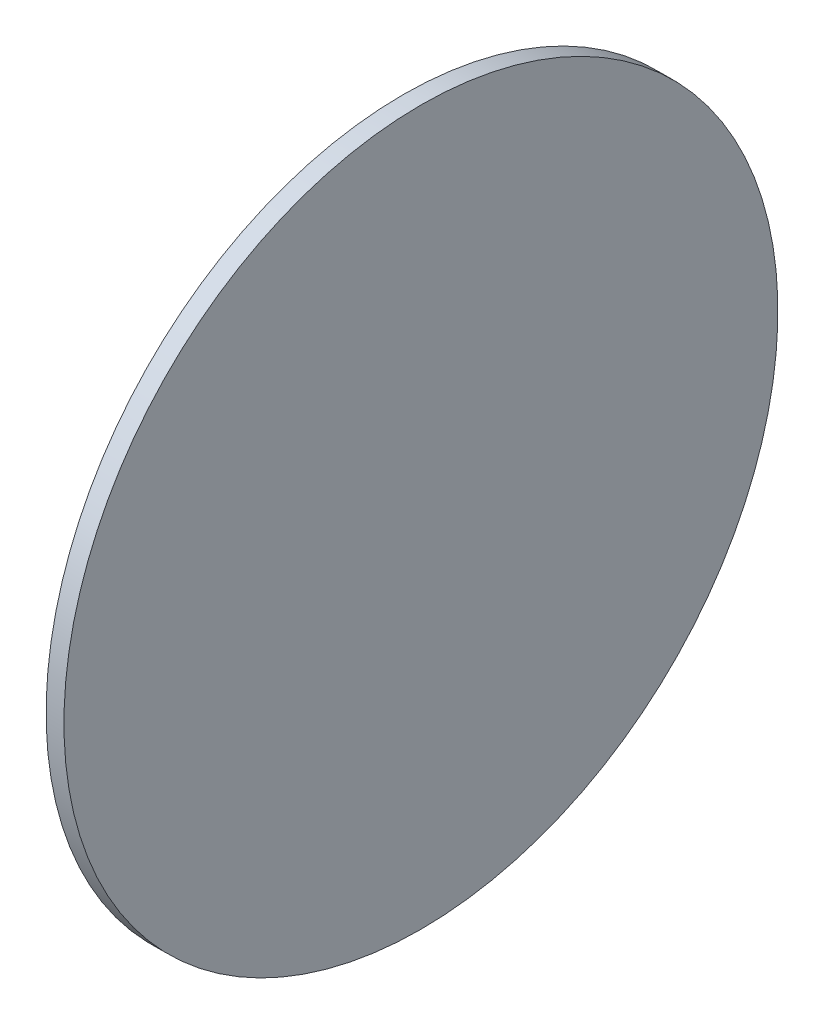
ISO-10303-21;
HEADER;
FILE_DESCRIPTION(('STEP AP214'),'2;1');
FILE_NAME('part.step','',(''),(''),'','','');
FILE_SCHEMA(('AUTOMOTIVE_DESIGN { 1 0 10303 214 1 1 1 1 }'));
ENDSEC;
DATA;
#1=APPLICATION_CONTEXT('core data for automotive mechanical design processes');
#2=APPLICATION_PROTOCOL_DEFINITION('international standard','automotive_design',2000,#1);
#3=PRODUCT_CONTEXT('',#1,'mechanical');
#4=PRODUCT('Part','Part','',(#3));
#5=PRODUCT_RELATED_PRODUCT_CATEGORY('part','',(#4));
#6=PRODUCT_DEFINITION_FORMATION('','',#4);
#7=PRODUCT_DEFINITION_CONTEXT('part definition',#1,'design');
#8=PRODUCT_DEFINITION('design','',#6,#7);
#9=PRODUCT_DEFINITION_SHAPE('','',#8);
#10=(LENGTH_UNIT() NAMED_UNIT(*) SI_UNIT(.MILLI.,.METRE.));
#11=(NAMED_UNIT(*) PLANE_ANGLE_UNIT() SI_UNIT($,.RADIAN.));
#12=(NAMED_UNIT(*) SI_UNIT($,.STERADIAN.) SOLID_ANGLE_UNIT());
#13=UNCERTAINTY_MEASURE_WITH_UNIT(LENGTH_MEASURE(1.E-05),#10,'distance_accuracy_value','');
#14=(GEOMETRIC_REPRESENTATION_CONTEXT(3) GLOBAL_UNCERTAINTY_ASSIGNED_CONTEXT((#13)) GLOBAL_UNIT_ASSIGNED_CONTEXT((#10,
#11,#12)) REPRESENTATION_CONTEXT('',''));
#15=CARTESIAN_POINT('',(0.,0.,0.));
#16=DIRECTION('',(0.,0.,1.));
#17=DIRECTION('',(1.,0.,0.));
#18=AXIS2_PLACEMENT_3D('',#15,#16,#17);
#19=CARTESIAN_POINT('',(218.672232897696,49.8959813156576,67.8606367334853));
#20=DIRECTION('',(1.,0.,0.));
#21=DIRECTION('',(0.,1.,0.));
#22=AXIS2_PLACEMENT_3D('',#19,#20,#21);
#23=CYLINDRICAL_SURFACE('',#22,9.99999999999999);
#24=CARTESIAN_POINT('',(218.672232897696,49.8959813156576,67.8606367334853));
#25=DIRECTION('',(-1.,0.,0.));
#26=DIRECTION('',(0.,-1.,0.));
#27=AXIS2_PLACEMENT_3D('',#24,#25,#26);
#28=CIRCLE('',#27,9.99999999999999);
#29=CARTESIAN_POINT('',(218.672232897696,39.8959813156576,67.8606367334853));
#30=VERTEX_POINT('',#29);
#31=EDGE_CURVE('E46',#30,#30,#28,.T.);
#32=ORIENTED_EDGE('',*,*,#31,.F.);
#33=EDGE_LOOP('',(#32));
#34=FACE_BOUND('',#33,.T.);
#35=CARTESIAN_POINT('',(219.172232897696,49.8959813156576,67.8606367334853));
#36=DIRECTION('',(-1.,0.,0.));
#37=DIRECTION('',(0.,-1.,0.));
#38=AXIS2_PLACEMENT_3D('',#35,#36,#37);
#39=CIRCLE('',#38,9.99999999999999);
#40=CARTESIAN_POINT('',(219.172232897696,39.8959813156576,67.8606367334853));
#41=VERTEX_POINT('',#40);
#42=EDGE_CURVE('E10',#41,#41,#39,.T.);
#43=ORIENTED_EDGE('',*,*,#42,.T.);
#44=EDGE_LOOP('',(#43));
#45=FACE_BOUND('',#44,.T.);
#46=ADVANCED_FACE('F36',(#34,#45),#23,.T.);
#47=CARTESIAN_POINT('',(219.172232897696,49.8959813156576,67.8606367334853));
#48=DIRECTION('',(-1.,0.,0.));
#49=DIRECTION('',(0.,-1.,0.));
#50=AXIS2_PLACEMENT_3D('',#47,#48,#49);
#51=PLANE('',#50);
#52=ORIENTED_EDGE('',*,*,#42,.F.);
#53=EDGE_LOOP('',(#52));
#54=FACE_BOUND('',#53,.T.);
#55=ADVANCED_FACE('F56',(#54),#51,.F.);
#56=CARTESIAN_POINT('',(218.672232897696,49.8959813156576,67.8606367334853));
#57=DIRECTION('',(-1.,0.,0.));
#58=DIRECTION('',(0.,-1.,0.));
#59=AXIS2_PLACEMENT_3D('',#56,#57,#58);
#60=CONICAL_SURFACE('',#59,9.99999999999999,0.872664625997167);
#61=CARTESIAN_POINT('',(218.872232897696,49.8959813156576,67.8606367334853));
#62=DIRECTION('',(-1.,0.,0.));
#63=DIRECTION('',(0.,-1.,0.));
#64=AXIS2_PLACEMENT_3D('',#61,#62,#63);
#65=CIRCLE('',#64,9.76164928148114);
#66=CARTESIAN_POINT('',(218.872232897696,40.1343320341765,67.8606367334853));
#67=VERTEX_POINT('',#66);
#68=EDGE_CURVE('E42',#67,#67,#65,.T.);
#69=ORIENTED_EDGE('',*,*,#68,.F.);
#70=EDGE_LOOP('',(#69));
#71=FACE_BOUND('',#70,.T.);
#72=ORIENTED_EDGE('',*,*,#31,.T.);
#73=EDGE_LOOP('',(#72));
#74=FACE_BOUND('',#73,.T.);
#75=ADVANCED_FACE('F53',(#71,#74),#60,.F.);
#76=CARTESIAN_POINT('',(218.872232897696,49.8959813156576,67.8606367334853));
#77=DIRECTION('',(-1.,0.,0.));
#78=DIRECTION('',(0.,-1.,0.));
#79=AXIS2_PLACEMENT_3D('',#76,#77,#78);
#80=PLANE('',#79);
#81=ORIENTED_EDGE('',*,*,#68,.T.);
#82=EDGE_LOOP('',(#81));
#83=FACE_BOUND('',#82,.T.);
#84=ADVANCED_FACE('F64',(#83),#80,.T.);
#85=CLOSED_SHELL('',(#46,#55,#75,#84));
#86=MANIFOLD_SOLID_BREP('B2',#85);
#87=ADVANCED_BREP_SHAPE_REPRESENTATION('',(#18,#86),#14);
#88=SHAPE_DEFINITION_REPRESENTATION(#9,#87);
ENDSEC;
END-ISO-10303-21;
